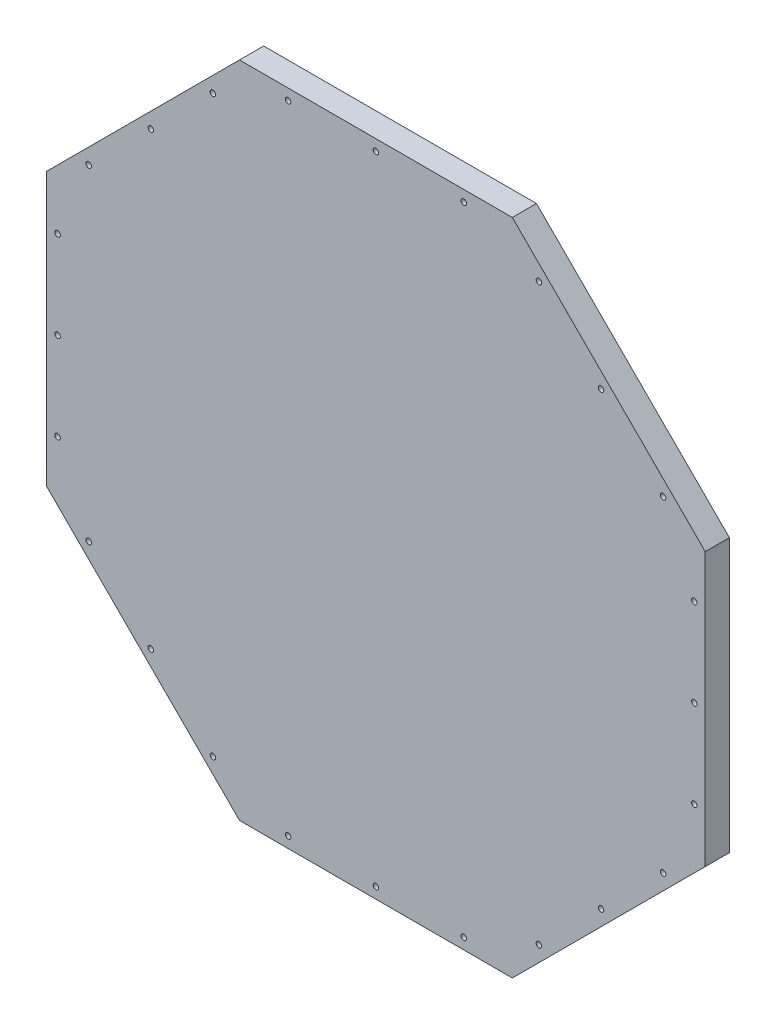
ISO-10303-21;
HEADER;
FILE_DESCRIPTION(('STEP AP214'),'2;1');
FILE_NAME('part.step','',(''),(''),'','','');
FILE_SCHEMA(('AUTOMOTIVE_DESIGN { 1 0 10303 214 1 1 1 1 }'));
ENDSEC;
DATA;
#1=APPLICATION_CONTEXT('core data for automotive mechanical design processes');
#2=APPLICATION_PROTOCOL_DEFINITION('international standard','automotive_design',2000,#1);
#3=PRODUCT_CONTEXT('',#1,'mechanical');
#4=PRODUCT('Part','Part','',(#3));
#5=PRODUCT_RELATED_PRODUCT_CATEGORY('part','',(#4));
#6=PRODUCT_DEFINITION_FORMATION('','',#4);
#7=PRODUCT_DEFINITION_CONTEXT('part definition',#1,'design');
#8=PRODUCT_DEFINITION('design','',#6,#7);
#9=PRODUCT_DEFINITION_SHAPE('','',#8);
#10=(LENGTH_UNIT() NAMED_UNIT(*) SI_UNIT(.MILLI.,.METRE.));
#11=(NAMED_UNIT(*) PLANE_ANGLE_UNIT() SI_UNIT($,.RADIAN.));
#12=(NAMED_UNIT(*) SI_UNIT($,.STERADIAN.) SOLID_ANGLE_UNIT());
#13=UNCERTAINTY_MEASURE_WITH_UNIT(LENGTH_MEASURE(1.E-05),#10,'distance_accuracy_value','');
#14=(GEOMETRIC_REPRESENTATION_CONTEXT(3) GLOBAL_UNCERTAINTY_ASSIGNED_CONTEXT((#13)) GLOBAL_UNIT_ASSIGNED_CONTEXT((#10,
#11,#12)) REPRESENTATION_CONTEXT('',''));
#15=CARTESIAN_POINT('',(0.,0.,0.));
#16=DIRECTION('',(0.,0.,1.));
#17=DIRECTION('',(1.,0.,0.));
#18=AXIS2_PLACEMENT_3D('',#15,#16,#17);
#19=CARTESIAN_POINT('',(0.,0.,22.));
#20=DIRECTION('',(0.,0.,1.));
#21=DIRECTION('',(1.,0.,0.));
#22=AXIS2_PLACEMENT_3D('',#19,#20,#21);
#23=PLANE('',#22);
#24=CARTESIAN_POINT('',(-148.492424049175,261.629509039022,22.));
#25=DIRECTION('',(0.,0.,1.));
#26=DIRECTION('',(1.,0.,0.));
#27=AXIS2_PLACEMENT_3D('',#24,#25,#26);
#28=CIRCLE('',#27,2.50000000000389);
#29=CARTESIAN_POINT('',(-145.992424049171,261.629509039022,22.));
#30=VERTEX_POINT('',#29);
#31=EDGE_CURVE('E308',#30,#30,#28,.T.);
#32=ORIENTED_EDGE('',*,*,#31,.F.);
#33=EDGE_LOOP('',(#32));
#34=FACE_BOUND('',#33,.T.);
#35=CARTESIAN_POINT('',(-289.999999999999,-80.0000000000015,22.));
#36=DIRECTION('',(0.,0.,1.));
#37=DIRECTION('',(1.,0.,0.));
#38=AXIS2_PLACEMENT_3D('',#35,#36,#37);
#39=CIRCLE('',#38,2.50000000000505);
#40=CARTESIAN_POINT('',(-287.499999999993,-80.0000000000015,22.));
#41=VERTEX_POINT('',#40);
#42=EDGE_CURVE('E296',#41,#41,#39,.T.);
#43=ORIENTED_EDGE('',*,*,#42,.F.);
#44=EDGE_LOOP('',(#43));
#45=FACE_BOUND('',#44,.T.);
#46=CARTESIAN_POINT('',(-289.999999999998,-1.49135667060718E-12,22.));
#47=DIRECTION('',(0.,0.,1.));
#48=DIRECTION('',(1.,0.,0.));
#49=AXIS2_PLACEMENT_3D('',#46,#47,#48);
#50=CIRCLE('',#49,2.50000000000482);
#51=CARTESIAN_POINT('',(-287.499999999994,-1.49135667060718E-12,22.));
#52=VERTEX_POINT('',#51);
#53=EDGE_CURVE('E284',#52,#52,#50,.T.);
#54=ORIENTED_EDGE('',*,*,#53,.F.);
#55=EDGE_LOOP('',(#54));
#56=FACE_BOUND('',#55,.T.);
#57=CARTESIAN_POINT('',(-261.62950903902,-148.492424049176,22.));
#58=DIRECTION('',(0.,0.,1.));
#59=DIRECTION('',(1.,0.,0.));
#60=AXIS2_PLACEMENT_3D('',#57,#58,#59);
#61=CIRCLE('',#60,2.500000000005);
#62=CARTESIAN_POINT('',(-259.129509039015,-148.492424049176,22.));
#63=VERTEX_POINT('',#62);
#64=EDGE_CURVE('E272',#63,#63,#61,.T.);
#65=ORIENTED_EDGE('',*,*,#64,.F.);
#66=EDGE_LOOP('',(#65));
#67=FACE_BOUND('',#66,.T.);
#68=CARTESIAN_POINT('',(80.000000000003,-290.,22.));
#69=DIRECTION('',(0.,0.,1.));
#70=DIRECTION('',(1.,0.,0.));
#71=AXIS2_PLACEMENT_3D('',#68,#69,#70);
#72=CIRCLE('',#71,2.50000000000505);
#73=CARTESIAN_POINT('',(82.5000000000081,-290.,22.));
#74=VERTEX_POINT('',#73);
#75=EDGE_CURVE('E260',#74,#74,#72,.T.);
#76=ORIENTED_EDGE('',*,*,#75,.F.);
#77=EDGE_LOOP('',(#76));
#78=FACE_BOUND('',#77,.T.);
#79=CARTESIAN_POINT('',(3.03658391713144E-12,-290.,22.));
#80=DIRECTION('',(0.,0.,1.));
#81=DIRECTION('',(1.,0.,0.));
#82=AXIS2_PLACEMENT_3D('',#79,#80,#81);
#83=CIRCLE('',#82,2.50000000000489);
#84=CARTESIAN_POINT('',(2.50000000000793,-290.,22.));
#85=VERTEX_POINT('',#84);
#86=EDGE_CURVE('E248',#85,#85,#83,.T.);
#87=ORIENTED_EDGE('',*,*,#86,.F.);
#88=EDGE_LOOP('',(#87));
#89=FACE_BOUND('',#88,.T.);
#90=CARTESIAN_POINT('',(148.492424049178,-261.629509039022,22.));
#91=DIRECTION('',(0.,0.,1.));
#92=DIRECTION('',(1.,0.,0.));
#93=AXIS2_PLACEMENT_3D('',#90,#91,#92);
#94=CIRCLE('',#93,2.50000000000353);
#95=CARTESIAN_POINT('',(150.992424049181,-261.629509039022,22.));
#96=VERTEX_POINT('',#95);
#97=EDGE_CURVE('E236',#96,#96,#94,.T.);
#98=ORIENTED_EDGE('',*,*,#97,.F.);
#99=EDGE_LOOP('',(#98));
#100=FACE_BOUND('',#99,.T.);
#101=CARTESIAN_POINT('',(290.000000000002,80.0000000000016,22.));
#102=DIRECTION('',(0.,0.,1.));
#103=DIRECTION('',(1.,0.,0.));
#104=AXIS2_PLACEMENT_3D('',#101,#102,#103);
#105=CIRCLE('',#104,2.50000000000215);
#106=CARTESIAN_POINT('',(292.500000000004,80.0000000000016,22.));
#107=VERTEX_POINT('',#106);
#108=EDGE_CURVE('E224',#107,#107,#105,.T.);
#109=ORIENTED_EDGE('',*,*,#108,.F.);
#110=EDGE_LOOP('',(#109));
#111=FACE_BOUND('',#110,.T.);
#112=CARTESIAN_POINT('',(290.000000000002,1.56686421589173E-12,22.));
#113=DIRECTION('',(0.,0.,1.));
#114=DIRECTION('',(1.,0.,0.));
#115=AXIS2_PLACEMENT_3D('',#112,#113,#114);
#116=CIRCLE('',#115,2.50000000000208);
#117=CARTESIAN_POINT('',(292.500000000004,1.56686421589173E-12,22.));
#118=VERTEX_POINT('',#117);
#119=EDGE_CURVE('E212',#118,#118,#116,.T.);
#120=ORIENTED_EDGE('',*,*,#119,.F.);
#121=EDGE_LOOP('',(#120));
#122=FACE_BOUND('',#121,.T.);
#123=CARTESIAN_POINT('',(261.629509039023,148.492424049176,22.));
#124=DIRECTION('',(0.,0.,1.));
#125=DIRECTION('',(1.,0.,0.));
#126=AXIS2_PLACEMENT_3D('',#123,#124,#125);
#127=CIRCLE('',#126,2.50000000000064);
#128=CARTESIAN_POINT('',(264.129509039024,148.492424049176,22.));
#129=VERTEX_POINT('',#128);
#130=EDGE_CURVE('E200',#129,#129,#127,.T.);
#131=ORIENTED_EDGE('',*,*,#130,.F.);
#132=EDGE_LOOP('',(#131));
#133=FACE_BOUND('',#132,.T.);
#134=CARTESIAN_POINT('',(-80.,290.,22.));
#135=DIRECTION('',(0.,0.,1.));
#136=DIRECTION('',(1.,0.,0.));
#137=AXIS2_PLACEMENT_3D('',#134,#135,#136);
#138=CIRCLE('',#137,2.5);
#139=CARTESIAN_POINT('',(-77.5,290.,22.));
#140=VERTEX_POINT('',#139);
#141=EDGE_CURVE('E188',#140,#140,#138,.T.);
#142=ORIENTED_EDGE('',*,*,#141,.F.);
#143=EDGE_LOOP('',(#142));
#144=FACE_BOUND('',#143,.T.);
#145=CARTESIAN_POINT('',(0.,290.,22.));
#146=DIRECTION('',(0.,0.,1.));
#147=DIRECTION('',(1.,0.,0.));
#148=AXIS2_PLACEMENT_3D('',#145,#146,#147);
#149=CIRCLE('',#148,2.5);
#150=CARTESIAN_POINT('',(2.50000000000002,290.,22.));
#151=VERTEX_POINT('',#150);
#152=EDGE_CURVE('E134',#151,#151,#149,.T.);
#153=ORIENTED_EDGE('',*,*,#152,.F.);
#154=EDGE_LOOP('',(#153));
#155=FACE_BOUND('',#154,.T.);
#156=DIRECTION('',(-0.707106781186547,0.707106781186547,0.));
#157=VECTOR('',#156,1.);
#158=CARTESIAN_POINT('',(300.,124.264068711929,22.));
#159=LINE('',#158,#157);
#160=CARTESIAN_POINT('',(300.,124.264068711929,22.));
#161=VERTEX_POINT('',#160);
#162=CARTESIAN_POINT('',(124.264068711929,300.,22.));
#163=VERTEX_POINT('',#162);
#164=EDGE_CURVE('E145',#161,#163,#159,.T.);
#165=ORIENTED_EDGE('',*,*,#164,.T.);
#166=DIRECTION('',(-1.,0.,0.));
#167=VECTOR('',#166,1.);
#168=CARTESIAN_POINT('',(124.264068711929,300.,22.));
#169=LINE('',#168,#167);
#170=CARTESIAN_POINT('',(-124.264068711929,300.,22.));
#171=VERTEX_POINT('',#170);
#172=EDGE_CURVE('E93',#163,#171,#169,.T.);
#173=ORIENTED_EDGE('',*,*,#172,.T.);
#174=DIRECTION('',(-0.707106781186547,-0.707106781186547,0.));
#175=VECTOR('',#174,1.);
#176=CARTESIAN_POINT('',(-124.264068711929,300.,22.));
#177=LINE('',#176,#175);
#178=CARTESIAN_POINT('',(-300.,124.264068711929,22.));
#179=VERTEX_POINT('',#178);
#180=EDGE_CURVE('E160',#171,#179,#177,.T.);
#181=ORIENTED_EDGE('',*,*,#180,.T.);
#182=DIRECTION('',(0.,-1.,0.));
#183=VECTOR('',#182,1.);
#184=CARTESIAN_POINT('',(-300.,124.264068711929,22.));
#185=LINE('',#184,#183);
#186=CARTESIAN_POINT('',(-300.,-124.264068711929,22.));
#187=VERTEX_POINT('',#186);
#188=EDGE_CURVE('E173',#179,#187,#185,.T.);
#189=ORIENTED_EDGE('',*,*,#188,.T.);
#190=DIRECTION('',(0.707106781186547,-0.707106781186547,0.));
#191=VECTOR('',#190,1.);
#192=CARTESIAN_POINT('',(-300.,-124.264068711929,22.));
#193=LINE('',#192,#191);
#194=CARTESIAN_POINT('',(-124.264068711929,-300.,22.));
#195=VERTEX_POINT('',#194);
#196=EDGE_CURVE('E112',#187,#195,#193,.T.);
#197=ORIENTED_EDGE('',*,*,#196,.T.);
#198=DIRECTION('',(1.,0.,0.));
#199=VECTOR('',#198,1.);
#200=CARTESIAN_POINT('',(-124.264068711929,-300.,22.));
#201=LINE('',#200,#199);
#202=CARTESIAN_POINT('',(124.264068711929,-300.,22.));
#203=VERTEX_POINT('',#202);
#204=EDGE_CURVE('E106',#195,#203,#201,.T.);
#205=ORIENTED_EDGE('',*,*,#204,.T.);
#206=DIRECTION('',(0.707106781186547,0.707106781186548,0.));
#207=VECTOR('',#206,1.);
#208=CARTESIAN_POINT('',(124.264068711929,-300.,22.));
#209=LINE('',#208,#207);
#210=CARTESIAN_POINT('',(300.,-124.264068711929,22.));
#211=VERTEX_POINT('',#210);
#212=EDGE_CURVE('E110',#203,#211,#209,.T.);
#213=ORIENTED_EDGE('',*,*,#212,.T.);
#214=DIRECTION('',(0.,1.,0.));
#215=VECTOR('',#214,1.);
#216=CARTESIAN_POINT('',(300.,-124.264068711929,22.));
#217=LINE('',#216,#215);
#218=EDGE_CURVE('E50',#211,#161,#217,.T.);
#219=ORIENTED_EDGE('',*,*,#218,.T.);
#220=EDGE_LOOP('',(#165,#173,#181,#189,#197,#205,#213,#219));
#221=FACE_BOUND('',#220,.T.);
#222=CARTESIAN_POINT('',(80.,290.,22.));
#223=DIRECTION('',(0.,0.,1.));
#224=DIRECTION('',(1.,0.,0.));
#225=AXIS2_PLACEMENT_3D('',#222,#223,#224);
#226=CIRCLE('',#225,2.5);
#227=CARTESIAN_POINT('',(82.5,290.,22.));
#228=VERTEX_POINT('',#227);
#229=EDGE_CURVE('E182',#228,#228,#226,.T.);
#230=ORIENTED_EDGE('',*,*,#229,.F.);
#231=EDGE_LOOP('',(#230));
#232=FACE_BOUND('',#231,.T.);
#233=CARTESIAN_POINT('',(205.060966544099,205.0609665441,22.));
#234=DIRECTION('',(0.,0.,1.));
#235=DIRECTION('',(1.,0.,0.));
#236=AXIS2_PLACEMENT_3D('',#233,#234,#235);
#237=CIRCLE('',#236,2.50000000000065);
#238=CARTESIAN_POINT('',(207.5609665441,205.0609665441,22.));
#239=VERTEX_POINT('',#238);
#240=EDGE_CURVE('E194',#239,#239,#237,.T.);
#241=ORIENTED_EDGE('',*,*,#240,.F.);
#242=EDGE_LOOP('',(#241));
#243=FACE_BOUND('',#242,.T.);
#244=CARTESIAN_POINT('',(148.492424049175,261.629509039024,22.));
#245=DIRECTION('',(0.,0.,1.));
#246=DIRECTION('',(1.,0.,0.));
#247=AXIS2_PLACEMENT_3D('',#244,#245,#246);
#248=CIRCLE('',#247,2.50000000000063);
#249=CARTESIAN_POINT('',(150.992424049176,261.629509039024,22.));
#250=VERTEX_POINT('',#249);
#251=EDGE_CURVE('E206',#250,#250,#248,.T.);
#252=ORIENTED_EDGE('',*,*,#251,.F.);
#253=EDGE_LOOP('',(#252));
#254=FACE_BOUND('',#253,.T.);
#255=CARTESIAN_POINT('',(290.000000000002,-79.9999999999984,22.));
#256=DIRECTION('',(0.,0.,1.));
#257=DIRECTION('',(1.,0.,0.));
#258=AXIS2_PLACEMENT_3D('',#255,#256,#257);
#259=CIRCLE('',#258,2.50000000000199);
#260=CARTESIAN_POINT('',(292.500000000004,-79.9999999999984,22.));
#261=VERTEX_POINT('',#260);
#262=EDGE_CURVE('E218',#261,#261,#259,.T.);
#263=ORIENTED_EDGE('',*,*,#262,.F.);
#264=EDGE_LOOP('',(#263));
#265=FACE_BOUND('',#264,.T.);
#266=CARTESIAN_POINT('',(205.060966544101,-205.060966544098,22.));
#267=DIRECTION('',(0.,0.,1.));
#268=DIRECTION('',(1.,0.,0.));
#269=AXIS2_PLACEMENT_3D('',#266,#267,#268);
#270=CIRCLE('',#269,2.50000000000364);
#271=CARTESIAN_POINT('',(207.560966544105,-205.060966544098,22.));
#272=VERTEX_POINT('',#271);
#273=EDGE_CURVE('E230',#272,#272,#270,.T.);
#274=ORIENTED_EDGE('',*,*,#273,.F.);
#275=EDGE_LOOP('',(#274));
#276=FACE_BOUND('',#275,.T.);
#277=CARTESIAN_POINT('',(261.629509039025,-148.492424049174,22.));
#278=DIRECTION('',(0.,0.,1.));
#279=DIRECTION('',(1.,0.,0.));
#280=AXIS2_PLACEMENT_3D('',#277,#278,#279);
#281=CIRCLE('',#280,2.50000000000378);
#282=CARTESIAN_POINT('',(264.129509039029,-148.492424049174,22.));
#283=VERTEX_POINT('',#282);
#284=EDGE_CURVE('E242',#283,#283,#281,.T.);
#285=ORIENTED_EDGE('',*,*,#284,.F.);
#286=EDGE_LOOP('',(#285));
#287=FACE_BOUND('',#286,.T.);
#288=CARTESIAN_POINT('',(-79.999999999997,-290.,22.));
#289=DIRECTION('',(0.,0.,1.));
#290=DIRECTION('',(1.,0.,0.));
#291=AXIS2_PLACEMENT_3D('',#288,#289,#290);
#292=CIRCLE('',#291,2.50000000000472);
#293=CARTESIAN_POINT('',(-77.4999999999922,-290.,22.));
#294=VERTEX_POINT('',#293);
#295=EDGE_CURVE('E254',#294,#294,#292,.T.);
#296=ORIENTED_EDGE('',*,*,#295,.F.);
#297=EDGE_LOOP('',(#296));
#298=FACE_BOUND('',#297,.T.);
#299=CARTESIAN_POINT('',(-205.060966544096,-205.0609665441,22.));
#300=DIRECTION('',(0.,0.,1.));
#301=DIRECTION('',(1.,0.,0.));
#302=AXIS2_PLACEMENT_3D('',#299,#300,#301);
#303=CIRCLE('',#302,2.50000000000521);
#304=CARTESIAN_POINT('',(-202.560966544091,-205.0609665441,22.));
#305=VERTEX_POINT('',#304);
#306=EDGE_CURVE('E266',#305,#305,#303,.T.);
#307=ORIENTED_EDGE('',*,*,#306,.F.);
#308=EDGE_LOOP('',(#307));
#309=FACE_BOUND('',#308,.T.);
#310=CARTESIAN_POINT('',(-148.492424049172,-261.629509039024,22.));
#311=DIRECTION('',(0.,0.,1.));
#312=DIRECTION('',(1.,0.,0.));
#313=AXIS2_PLACEMENT_3D('',#310,#311,#312);
#314=CIRCLE('',#313,2.50000000000537);
#315=CARTESIAN_POINT('',(-145.992424049167,-261.629509039024,22.));
#316=VERTEX_POINT('',#315);
#317=EDGE_CURVE('E278',#316,#316,#314,.T.);
#318=ORIENTED_EDGE('',*,*,#317,.F.);
#319=EDGE_LOOP('',(#318));
#320=FACE_BOUND('',#319,.T.);
#321=CARTESIAN_POINT('',(-289.999999999999,79.9999999999985,22.));
#322=DIRECTION('',(0.,0.,1.));
#323=DIRECTION('',(1.,0.,0.));
#324=AXIS2_PLACEMENT_3D('',#321,#322,#323);
#325=CIRCLE('',#324,2.50000000000454);
#326=CARTESIAN_POINT('',(-287.499999999994,79.9999999999985,22.));
#327=VERTEX_POINT('',#326);
#328=EDGE_CURVE('E290',#327,#327,#325,.T.);
#329=ORIENTED_EDGE('',*,*,#328,.F.);
#330=EDGE_LOOP('',(#329));
#331=FACE_BOUND('',#330,.T.);
#332=CARTESIAN_POINT('',(-205.060966544098,205.060966544098,22.));
#333=DIRECTION('',(0.,0.,1.));
#334=DIRECTION('',(1.,0.,0.));
#335=AXIS2_PLACEMENT_3D('',#332,#333,#334);
#336=CIRCLE('',#335,2.50000000000414);
#337=CARTESIAN_POINT('',(-202.560966544094,205.060966544098,22.));
#338=VERTEX_POINT('',#337);
#339=EDGE_CURVE('E302',#338,#338,#336,.T.);
#340=ORIENTED_EDGE('',*,*,#339,.F.);
#341=EDGE_LOOP('',(#340));
#342=FACE_BOUND('',#341,.T.);
#343=CARTESIAN_POINT('',(-261.629509039022,148.492424049174,22.));
#344=DIRECTION('',(0.,0.,1.));
#345=DIRECTION('',(1.,0.,0.));
#346=AXIS2_PLACEMENT_3D('',#343,#344,#345);
#347=CIRCLE('',#346,2.50000000000438);
#348=CARTESIAN_POINT('',(-259.129509039018,148.492424049174,22.));
#349=VERTEX_POINT('',#348);
#350=EDGE_CURVE('E314',#349,#349,#347,.T.);
#351=ORIENTED_EDGE('',*,*,#350,.F.);
#352=EDGE_LOOP('',(#351));
#353=FACE_BOUND('',#352,.T.);
#354=ADVANCED_FACE('F33',(#34,#45,#56,#67,#78,#89,#100,#111,#122,#133,#144,#155,#221,#232,#243,
#254,#265,#276,#287,#298,#309,#320,#331,#342,#353),#23,.T.);
#355=CARTESIAN_POINT('',(0.,0.,0.));
#356=DIRECTION('',(0.,0.,1.));
#357=DIRECTION('',(1.,0.,0.));
#358=AXIS2_PLACEMENT_3D('',#355,#356,#357);
#359=PLANE('',#358);
#360=DIRECTION('',(-0.707106781186547,0.707106781186547,0.));
#361=VECTOR('',#360,1.);
#362=CARTESIAN_POINT('',(300.,124.264068711929,0.));
#363=LINE('',#362,#361);
#364=CARTESIAN_POINT('',(300.,124.264068711929,0.));
#365=VERTEX_POINT('',#364);
#366=CARTESIAN_POINT('',(124.264068711929,300.,0.));
#367=VERTEX_POINT('',#366);
#368=EDGE_CURVE('E130',#365,#367,#363,.T.);
#369=ORIENTED_EDGE('',*,*,#368,.F.);
#370=DIRECTION('',(0.,1.,0.));
#371=VECTOR('',#370,1.);
#372=CARTESIAN_POINT('',(300.,-124.264068711929,0.));
#373=LINE('',#372,#371);
#374=CARTESIAN_POINT('',(300.,-124.264068711929,0.));
#375=VERTEX_POINT('',#374);
#376=EDGE_CURVE('E85',#375,#365,#373,.T.);
#377=ORIENTED_EDGE('',*,*,#376,.F.);
#378=DIRECTION('',(0.707106781186547,0.707106781186548,0.));
#379=VECTOR('',#378,1.);
#380=CARTESIAN_POINT('',(124.264068711929,-300.,0.));
#381=LINE('',#380,#379);
#382=CARTESIAN_POINT('',(124.264068711929,-300.,0.));
#383=VERTEX_POINT('',#382);
#384=EDGE_CURVE('E79',#383,#375,#381,.T.);
#385=ORIENTED_EDGE('',*,*,#384,.F.);
#386=DIRECTION('',(1.,0.,0.));
#387=VECTOR('',#386,1.);
#388=CARTESIAN_POINT('',(-124.264068711929,-300.,0.));
#389=LINE('',#388,#387);
#390=CARTESIAN_POINT('',(-124.264068711929,-300.,0.));
#391=VERTEX_POINT('',#390);
#392=EDGE_CURVE('E120',#391,#383,#389,.T.);
#393=ORIENTED_EDGE('',*,*,#392,.F.);
#394=DIRECTION('',(0.707106781186547,-0.707106781186547,0.));
#395=VECTOR('',#394,1.);
#396=CARTESIAN_POINT('',(-300.,-124.264068711929,0.));
#397=LINE('',#396,#395);
#398=CARTESIAN_POINT('',(-300.,-124.264068711929,0.));
#399=VERTEX_POINT('',#398);
#400=EDGE_CURVE('E140',#399,#391,#397,.T.);
#401=ORIENTED_EDGE('',*,*,#400,.F.);
#402=DIRECTION('',(0.,-1.,0.));
#403=VECTOR('',#402,1.);
#404=CARTESIAN_POINT('',(-300.,124.264068711929,0.));
#405=LINE('',#404,#403);
#406=CARTESIAN_POINT('',(-300.,124.264068711929,0.));
#407=VERTEX_POINT('',#406);
#408=EDGE_CURVE('E138',#407,#399,#405,.T.);
#409=ORIENTED_EDGE('',*,*,#408,.F.);
#410=DIRECTION('',(-0.707106781186547,-0.707106781186547,0.));
#411=VECTOR('',#410,1.);
#412=CARTESIAN_POINT('',(-124.264068711929,300.,0.));
#413=LINE('',#412,#411);
#414=CARTESIAN_POINT('',(-124.264068711929,300.,0.));
#415=VERTEX_POINT('',#414);
#416=EDGE_CURVE('E136',#415,#407,#413,.T.);
#417=ORIENTED_EDGE('',*,*,#416,.F.);
#418=DIRECTION('',(-1.,0.,0.));
#419=VECTOR('',#418,1.);
#420=CARTESIAN_POINT('',(124.264068711929,300.,0.));
#421=LINE('',#420,#419);
#422=EDGE_CURVE('E133',#367,#415,#421,.T.);
#423=ORIENTED_EDGE('',*,*,#422,.F.);
#424=EDGE_LOOP('',(#369,#377,#385,#393,#401,#409,#417,#423));
#425=FACE_BOUND('',#424,.T.);
#426=CARTESIAN_POINT('',(0.,290.,0.));
#427=DIRECTION('',(0.,0.,1.));
#428=DIRECTION('',(1.,0.,0.));
#429=AXIS2_PLACEMENT_3D('',#426,#427,#428);
#430=CIRCLE('',#429,2.5);
#431=CARTESIAN_POINT('',(2.50000000000002,290.,0.));
#432=VERTEX_POINT('',#431);
#433=EDGE_CURVE('E179',#432,#432,#430,.T.);
#434=ORIENTED_EDGE('',*,*,#433,.T.);
#435=EDGE_LOOP('',(#434));
#436=FACE_BOUND('',#435,.T.);
#437=CARTESIAN_POINT('',(80.,290.,0.));
#438=DIRECTION('',(0.,0.,1.));
#439=DIRECTION('',(1.,0.,0.));
#440=AXIS2_PLACEMENT_3D('',#437,#438,#439);
#441=CIRCLE('',#440,2.5);
#442=CARTESIAN_POINT('',(82.5,290.,0.));
#443=VERTEX_POINT('',#442);
#444=EDGE_CURVE('E185',#443,#443,#441,.T.);
#445=ORIENTED_EDGE('',*,*,#444,.T.);
#446=EDGE_LOOP('',(#445));
#447=FACE_BOUND('',#446,.T.);
#448=CARTESIAN_POINT('',(-80.,290.,0.));
#449=DIRECTION('',(0.,0.,1.));
#450=DIRECTION('',(1.,0.,0.));
#451=AXIS2_PLACEMENT_3D('',#448,#449,#450);
#452=CIRCLE('',#451,2.5);
#453=CARTESIAN_POINT('',(-77.5,290.,0.));
#454=VERTEX_POINT('',#453);
#455=EDGE_CURVE('E191',#454,#454,#452,.T.);
#456=ORIENTED_EDGE('',*,*,#455,.T.);
#457=EDGE_LOOP('',(#456));
#458=FACE_BOUND('',#457,.T.);
#459=CARTESIAN_POINT('',(205.060966544099,205.0609665441,0.));
#460=DIRECTION('',(0.,0.,1.));
#461=DIRECTION('',(1.,0.,0.));
#462=AXIS2_PLACEMENT_3D('',#459,#460,#461);
#463=CIRCLE('',#462,2.50000000000065);
#464=CARTESIAN_POINT('',(207.5609665441,205.0609665441,0.));
#465=VERTEX_POINT('',#464);
#466=EDGE_CURVE('E197',#465,#465,#463,.T.);
#467=ORIENTED_EDGE('',*,*,#466,.T.);
#468=EDGE_LOOP('',(#467));
#469=FACE_BOUND('',#468,.T.);
#470=CARTESIAN_POINT('',(261.629509039023,148.492424049176,0.));
#471=DIRECTION('',(0.,0.,1.));
#472=DIRECTION('',(1.,0.,0.));
#473=AXIS2_PLACEMENT_3D('',#470,#471,#472);
#474=CIRCLE('',#473,2.50000000000064);
#475=CARTESIAN_POINT('',(264.129509039024,148.492424049176,0.));
#476=VERTEX_POINT('',#475);
#477=EDGE_CURVE('E203',#476,#476,#474,.T.);
#478=ORIENTED_EDGE('',*,*,#477,.T.);
#479=EDGE_LOOP('',(#478));
#480=FACE_BOUND('',#479,.T.);
#481=CARTESIAN_POINT('',(148.492424049175,261.629509039024,0.));
#482=DIRECTION('',(0.,0.,1.));
#483=DIRECTION('',(1.,0.,0.));
#484=AXIS2_PLACEMENT_3D('',#481,#482,#483);
#485=CIRCLE('',#484,2.50000000000063);
#486=CARTESIAN_POINT('',(150.992424049176,261.629509039024,0.));
#487=VERTEX_POINT('',#486);
#488=EDGE_CURVE('E209',#487,#487,#485,.T.);
#489=ORIENTED_EDGE('',*,*,#488,.T.);
#490=EDGE_LOOP('',(#489));
#491=FACE_BOUND('',#490,.T.);
#492=CARTESIAN_POINT('',(290.000000000002,1.56686421589173E-12,0.));
#493=DIRECTION('',(0.,0.,1.));
#494=DIRECTION('',(1.,0.,0.));
#495=AXIS2_PLACEMENT_3D('',#492,#493,#494);
#496=CIRCLE('',#495,2.50000000000208);
#497=CARTESIAN_POINT('',(292.500000000004,1.56686421589173E-12,0.));
#498=VERTEX_POINT('',#497);
#499=EDGE_CURVE('E215',#498,#498,#496,.T.);
#500=ORIENTED_EDGE('',*,*,#499,.T.);
#501=EDGE_LOOP('',(#500));
#502=FACE_BOUND('',#501,.T.);
#503=CARTESIAN_POINT('',(290.000000000002,-79.9999999999984,0.));
#504=DIRECTION('',(0.,0.,1.));
#505=DIRECTION('',(1.,0.,0.));
#506=AXIS2_PLACEMENT_3D('',#503,#504,#505);
#507=CIRCLE('',#506,2.50000000000199);
#508=CARTESIAN_POINT('',(292.500000000004,-79.9999999999984,0.));
#509=VERTEX_POINT('',#508);
#510=EDGE_CURVE('E221',#509,#509,#507,.T.);
#511=ORIENTED_EDGE('',*,*,#510,.T.);
#512=EDGE_LOOP('',(#511));
#513=FACE_BOUND('',#512,.T.);
#514=CARTESIAN_POINT('',(290.000000000002,80.0000000000016,0.));
#515=DIRECTION('',(0.,0.,1.));
#516=DIRECTION('',(1.,0.,0.));
#517=AXIS2_PLACEMENT_3D('',#514,#515,#516);
#518=CIRCLE('',#517,2.50000000000215);
#519=CARTESIAN_POINT('',(292.500000000004,80.0000000000016,0.));
#520=VERTEX_POINT('',#519);
#521=EDGE_CURVE('E227',#520,#520,#518,.T.);
#522=ORIENTED_EDGE('',*,*,#521,.T.);
#523=EDGE_LOOP('',(#522));
#524=FACE_BOUND('',#523,.T.);
#525=CARTESIAN_POINT('',(205.060966544101,-205.060966544098,0.));
#526=DIRECTION('',(0.,0.,1.));
#527=DIRECTION('',(1.,0.,0.));
#528=AXIS2_PLACEMENT_3D('',#525,#526,#527);
#529=CIRCLE('',#528,2.50000000000364);
#530=CARTESIAN_POINT('',(207.560966544105,-205.060966544098,0.));
#531=VERTEX_POINT('',#530);
#532=EDGE_CURVE('E233',#531,#531,#529,.T.);
#533=ORIENTED_EDGE('',*,*,#532,.T.);
#534=EDGE_LOOP('',(#533));
#535=FACE_BOUND('',#534,.T.);
#536=CARTESIAN_POINT('',(148.492424049178,-261.629509039022,0.));
#537=DIRECTION('',(0.,0.,1.));
#538=DIRECTION('',(1.,0.,0.));
#539=AXIS2_PLACEMENT_3D('',#536,#537,#538);
#540=CIRCLE('',#539,2.50000000000353);
#541=CARTESIAN_POINT('',(150.992424049181,-261.629509039022,0.));
#542=VERTEX_POINT('',#541);
#543=EDGE_CURVE('E239',#542,#542,#540,.T.);
#544=ORIENTED_EDGE('',*,*,#543,.T.);
#545=EDGE_LOOP('',(#544));
#546=FACE_BOUND('',#545,.T.);
#547=CARTESIAN_POINT('',(261.629509039025,-148.492424049174,0.));
#548=DIRECTION('',(0.,0.,1.));
#549=DIRECTION('',(1.,0.,0.));
#550=AXIS2_PLACEMENT_3D('',#547,#548,#549);
#551=CIRCLE('',#550,2.50000000000378);
#552=CARTESIAN_POINT('',(264.129509039029,-148.492424049174,0.));
#553=VERTEX_POINT('',#552);
#554=EDGE_CURVE('E245',#553,#553,#551,.T.);
#555=ORIENTED_EDGE('',*,*,#554,.T.);
#556=EDGE_LOOP('',(#555));
#557=FACE_BOUND('',#556,.T.);
#558=CARTESIAN_POINT('',(3.03658391713144E-12,-290.,0.));
#559=DIRECTION('',(0.,0.,1.));
#560=DIRECTION('',(1.,0.,0.));
#561=AXIS2_PLACEMENT_3D('',#558,#559,#560);
#562=CIRCLE('',#561,2.50000000000489);
#563=CARTESIAN_POINT('',(2.50000000000793,-290.,0.));
#564=VERTEX_POINT('',#563);
#565=EDGE_CURVE('E251',#564,#564,#562,.T.);
#566=ORIENTED_EDGE('',*,*,#565,.T.);
#567=EDGE_LOOP('',(#566));
#568=FACE_BOUND('',#567,.T.);
#569=CARTESIAN_POINT('',(-79.999999999997,-290.,0.));
#570=DIRECTION('',(0.,0.,1.));
#571=DIRECTION('',(1.,0.,0.));
#572=AXIS2_PLACEMENT_3D('',#569,#570,#571);
#573=CIRCLE('',#572,2.50000000000472);
#574=CARTESIAN_POINT('',(-77.4999999999922,-290.,0.));
#575=VERTEX_POINT('',#574);
#576=EDGE_CURVE('E257',#575,#575,#573,.T.);
#577=ORIENTED_EDGE('',*,*,#576,.T.);
#578=EDGE_LOOP('',(#577));
#579=FACE_BOUND('',#578,.T.);
#580=CARTESIAN_POINT('',(80.000000000003,-290.,0.));
#581=DIRECTION('',(0.,0.,1.));
#582=DIRECTION('',(1.,0.,0.));
#583=AXIS2_PLACEMENT_3D('',#580,#581,#582);
#584=CIRCLE('',#583,2.50000000000505);
#585=CARTESIAN_POINT('',(82.5000000000081,-290.,0.));
#586=VERTEX_POINT('',#585);
#587=EDGE_CURVE('E263',#586,#586,#584,.T.);
#588=ORIENTED_EDGE('',*,*,#587,.T.);
#589=EDGE_LOOP('',(#588));
#590=FACE_BOUND('',#589,.T.);
#591=CARTESIAN_POINT('',(-205.060966544096,-205.0609665441,0.));
#592=DIRECTION('',(0.,0.,1.));
#593=DIRECTION('',(1.,0.,0.));
#594=AXIS2_PLACEMENT_3D('',#591,#592,#593);
#595=CIRCLE('',#594,2.50000000000521);
#596=CARTESIAN_POINT('',(-202.560966544091,-205.0609665441,0.));
#597=VERTEX_POINT('',#596);
#598=EDGE_CURVE('E269',#597,#597,#595,.T.);
#599=ORIENTED_EDGE('',*,*,#598,.T.);
#600=EDGE_LOOP('',(#599));
#601=FACE_BOUND('',#600,.T.);
#602=CARTESIAN_POINT('',(-261.62950903902,-148.492424049176,0.));
#603=DIRECTION('',(0.,0.,1.));
#604=DIRECTION('',(1.,0.,0.));
#605=AXIS2_PLACEMENT_3D('',#602,#603,#604);
#606=CIRCLE('',#605,2.500000000005);
#607=CARTESIAN_POINT('',(-259.129509039015,-148.492424049176,0.));
#608=VERTEX_POINT('',#607);
#609=EDGE_CURVE('E275',#608,#608,#606,.T.);
#610=ORIENTED_EDGE('',*,*,#609,.T.);
#611=EDGE_LOOP('',(#610));
#612=FACE_BOUND('',#611,.T.);
#613=CARTESIAN_POINT('',(-148.492424049172,-261.629509039024,0.));
#614=DIRECTION('',(0.,0.,1.));
#615=DIRECTION('',(1.,0.,0.));
#616=AXIS2_PLACEMENT_3D('',#613,#614,#615);
#617=CIRCLE('',#616,2.50000000000537);
#618=CARTESIAN_POINT('',(-145.992424049167,-261.629509039024,0.));
#619=VERTEX_POINT('',#618);
#620=EDGE_CURVE('E281',#619,#619,#617,.T.);
#621=ORIENTED_EDGE('',*,*,#620,.T.);
#622=EDGE_LOOP('',(#621));
#623=FACE_BOUND('',#622,.T.);
#624=CARTESIAN_POINT('',(-289.999999999998,-1.49135667060718E-12,0.));
#625=DIRECTION('',(0.,0.,1.));
#626=DIRECTION('',(1.,0.,0.));
#627=AXIS2_PLACEMENT_3D('',#624,#625,#626);
#628=CIRCLE('',#627,2.50000000000482);
#629=CARTESIAN_POINT('',(-287.499999999994,-1.49135667060718E-12,0.));
#630=VERTEX_POINT('',#629);
#631=EDGE_CURVE('E287',#630,#630,#628,.T.);
#632=ORIENTED_EDGE('',*,*,#631,.T.);
#633=EDGE_LOOP('',(#632));
#634=FACE_BOUND('',#633,.T.);
#635=CARTESIAN_POINT('',(-289.999999999999,79.9999999999985,0.));
#636=DIRECTION('',(0.,0.,1.));
#637=DIRECTION('',(1.,0.,0.));
#638=AXIS2_PLACEMENT_3D('',#635,#636,#637);
#639=CIRCLE('',#638,2.50000000000454);
#640=CARTESIAN_POINT('',(-287.499999999994,79.9999999999985,0.));
#641=VERTEX_POINT('',#640);
#642=EDGE_CURVE('E293',#641,#641,#639,.T.);
#643=ORIENTED_EDGE('',*,*,#642,.T.);
#644=EDGE_LOOP('',(#643));
#645=FACE_BOUND('',#644,.T.);
#646=CARTESIAN_POINT('',(-289.999999999999,-80.0000000000015,0.));
#647=DIRECTION('',(0.,0.,1.));
#648=DIRECTION('',(1.,0.,0.));
#649=AXIS2_PLACEMENT_3D('',#646,#647,#648);
#650=CIRCLE('',#649,2.50000000000505);
#651=CARTESIAN_POINT('',(-287.499999999993,-80.0000000000015,0.));
#652=VERTEX_POINT('',#651);
#653=EDGE_CURVE('E299',#652,#652,#650,.T.);
#654=ORIENTED_EDGE('',*,*,#653,.T.);
#655=EDGE_LOOP('',(#654));
#656=FACE_BOUND('',#655,.T.);
#657=CARTESIAN_POINT('',(-205.060966544098,205.060966544098,0.));
#658=DIRECTION('',(0.,0.,1.));
#659=DIRECTION('',(1.,0.,0.));
#660=AXIS2_PLACEMENT_3D('',#657,#658,#659);
#661=CIRCLE('',#660,2.50000000000414);
#662=CARTESIAN_POINT('',(-202.560966544094,205.060966544098,0.));
#663=VERTEX_POINT('',#662);
#664=EDGE_CURVE('E305',#663,#663,#661,.T.);
#665=ORIENTED_EDGE('',*,*,#664,.T.);
#666=EDGE_LOOP('',(#665));
#667=FACE_BOUND('',#666,.T.);
#668=CARTESIAN_POINT('',(-148.492424049175,261.629509039022,0.));
#669=DIRECTION('',(0.,0.,1.));
#670=DIRECTION('',(1.,0.,0.));
#671=AXIS2_PLACEMENT_3D('',#668,#669,#670);
#672=CIRCLE('',#671,2.50000000000389);
#673=CARTESIAN_POINT('',(-145.992424049171,261.629509039022,0.));
#674=VERTEX_POINT('',#673);
#675=EDGE_CURVE('E311',#674,#674,#672,.T.);
#676=ORIENTED_EDGE('',*,*,#675,.T.);
#677=EDGE_LOOP('',(#676));
#678=FACE_BOUND('',#677,.T.);
#679=CARTESIAN_POINT('',(-261.629509039022,148.492424049174,0.));
#680=DIRECTION('',(0.,0.,1.));
#681=DIRECTION('',(1.,0.,0.));
#682=AXIS2_PLACEMENT_3D('',#679,#680,#681);
#683=CIRCLE('',#682,2.50000000000438);
#684=CARTESIAN_POINT('',(-259.129509039018,148.492424049174,0.));
#685=VERTEX_POINT('',#684);
#686=EDGE_CURVE('E317',#685,#685,#683,.T.);
#687=ORIENTED_EDGE('',*,*,#686,.T.);
#688=EDGE_LOOP('',(#687));
#689=FACE_BOUND('',#688,.T.);
#690=ADVANCED_FACE('F164',(#425,#436,#447,#458,#469,#480,#491,#502,#513,#524,#535,#546,#557,
#568,#579,#590,#601,#612,#623,#634,#645,#656,#667,#678,#689),#359,.F.);
#691=CARTESIAN_POINT('',(300.,124.264068711929,22.));
#692=DIRECTION('',(-0.707106781186548,-0.707106781186548,0.));
#693=DIRECTION('',(0.707106781186548,-0.707106781186548,0.));
#694=AXIS2_PLACEMENT_3D('',#691,#692,#693);
#695=PLANE('',#694);
#696=ORIENTED_EDGE('',*,*,#368,.T.);
#697=DIRECTION('',(0.,0.,-1.));
#698=VECTOR('',#697,1.);
#699=CARTESIAN_POINT('',(124.264068711929,300.,22.));
#700=LINE('',#699,#698);
#701=EDGE_CURVE('E11',#163,#367,#700,.T.);
#702=ORIENTED_EDGE('',*,*,#701,.F.);
#703=ORIENTED_EDGE('',*,*,#164,.F.);
#704=DIRECTION('',(0.,0.,-1.));
#705=VECTOR('',#704,1.);
#706=CARTESIAN_POINT('',(300.,124.264068711929,22.));
#707=LINE('',#706,#705);
#708=EDGE_CURVE('E126',#161,#365,#707,.T.);
#709=ORIENTED_EDGE('',*,*,#708,.T.);
#710=EDGE_LOOP('',(#696,#702,#703,#709));
#711=FACE_BOUND('',#710,.T.);
#712=ADVANCED_FACE('F35',(#711),#695,.F.);
#713=CARTESIAN_POINT('',(124.264068711929,300.,22.));
#714=DIRECTION('',(0.,-1.,0.));
#715=DIRECTION('',(1.,0.,0.));
#716=AXIS2_PLACEMENT_3D('',#713,#714,#715);
#717=PLANE('',#716);
#718=ORIENTED_EDGE('',*,*,#422,.T.);
#719=DIRECTION('',(0.,0.,-1.));
#720=VECTOR('',#719,1.);
#721=CARTESIAN_POINT('',(-124.264068711929,300.,22.));
#722=LINE('',#721,#720);
#723=EDGE_CURVE('E42',#171,#415,#722,.T.);
#724=ORIENTED_EDGE('',*,*,#723,.F.);
#725=ORIENTED_EDGE('',*,*,#172,.F.);
#726=ORIENTED_EDGE('',*,*,#701,.T.);
#727=EDGE_LOOP('',(#718,#724,#725,#726));
#728=FACE_BOUND('',#727,.T.);
#729=ADVANCED_FACE('F351',(#728),#717,.F.);
#730=CARTESIAN_POINT('',(-124.264068711929,300.,22.));
#731=DIRECTION('',(0.707106781186548,-0.707106781186547,0.));
#732=DIRECTION('',(0.707106781186547,0.707106781186548,0.));
#733=AXIS2_PLACEMENT_3D('',#730,#731,#732);
#734=PLANE('',#733);
#735=ORIENTED_EDGE('',*,*,#416,.T.);
#736=DIRECTION('',(0.,0.,-1.));
#737=VECTOR('',#736,1.);
#738=CARTESIAN_POINT('',(-300.,124.264068711929,22.));
#739=LINE('',#738,#737);
#740=EDGE_CURVE('E152',#179,#407,#739,.T.);
#741=ORIENTED_EDGE('',*,*,#740,.F.);
#742=ORIENTED_EDGE('',*,*,#180,.F.);
#743=ORIENTED_EDGE('',*,*,#723,.T.);
#744=EDGE_LOOP('',(#735,#741,#742,#743));
#745=FACE_BOUND('',#744,.T.);
#746=ADVANCED_FACE('F158',(#745),#734,.F.);
#747=CARTESIAN_POINT('',(-300.,124.264068711929,22.));
#748=DIRECTION('',(1.,0.,0.));
#749=DIRECTION('',(0.,1.,0.));
#750=AXIS2_PLACEMENT_3D('',#747,#748,#749);
#751=PLANE('',#750);
#752=ORIENTED_EDGE('',*,*,#408,.T.);
#753=DIRECTION('',(0.,0.,-1.));
#754=VECTOR('',#753,1.);
#755=CARTESIAN_POINT('',(-300.,-124.264068711929,22.));
#756=LINE('',#755,#754);
#757=EDGE_CURVE('E149',#187,#399,#756,.T.);
#758=ORIENTED_EDGE('',*,*,#757,.F.);
#759=ORIENTED_EDGE('',*,*,#188,.F.);
#760=ORIENTED_EDGE('',*,*,#740,.T.);
#761=EDGE_LOOP('',(#752,#758,#759,#760));
#762=FACE_BOUND('',#761,.T.);
#763=ADVANCED_FACE('F169',(#762),#751,.F.);
#764=CARTESIAN_POINT('',(-300.,-124.264068711929,22.));
#765=DIRECTION('',(0.707106781186548,0.707106781186548,0.));
#766=DIRECTION('',(-0.707106781186548,0.707106781186548,0.));
#767=AXIS2_PLACEMENT_3D('',#764,#765,#766);
#768=PLANE('',#767);
#769=ORIENTED_EDGE('',*,*,#400,.T.);
#770=DIRECTION('',(0.,0.,-1.));
#771=VECTOR('',#770,1.);
#772=CARTESIAN_POINT('',(-124.264068711929,-300.,22.));
#773=LINE('',#772,#771);
#774=EDGE_CURVE('E121',#195,#391,#773,.T.);
#775=ORIENTED_EDGE('',*,*,#774,.F.);
#776=ORIENTED_EDGE('',*,*,#196,.F.);
#777=ORIENTED_EDGE('',*,*,#757,.T.);
#778=EDGE_LOOP('',(#769,#775,#776,#777));
#779=FACE_BOUND('',#778,.T.);
#780=ADVANCED_FACE('F172',(#779),#768,.F.);
#781=CARTESIAN_POINT('',(-124.264068711929,-300.,22.));
#782=DIRECTION('',(0.,1.,0.));
#783=DIRECTION('',(-1.,0.,0.));
#784=AXIS2_PLACEMENT_3D('',#781,#782,#783);
#785=PLANE('',#784);
#786=ORIENTED_EDGE('',*,*,#392,.T.);
#787=DIRECTION('',(0.,0.,-1.));
#788=VECTOR('',#787,1.);
#789=CARTESIAN_POINT('',(124.264068711929,-300.,22.));
#790=LINE('',#789,#788);
#791=EDGE_CURVE('E117',#203,#383,#790,.T.);
#792=ORIENTED_EDGE('',*,*,#791,.F.);
#793=ORIENTED_EDGE('',*,*,#204,.F.);
#794=ORIENTED_EDGE('',*,*,#774,.T.);
#795=EDGE_LOOP('',(#786,#792,#793,#794));
#796=FACE_BOUND('',#795,.T.);
#797=ADVANCED_FACE('F118',(#796),#785,.F.);
#798=CARTESIAN_POINT('',(124.264068711929,-300.,22.));
#799=DIRECTION('',(-0.707106781186548,0.707106781186547,0.));
#800=DIRECTION('',(-0.707106781186547,-0.707106781186548,0.));
#801=AXIS2_PLACEMENT_3D('',#798,#799,#800);
#802=PLANE('',#801);
#803=ORIENTED_EDGE('',*,*,#384,.T.);
#804=DIRECTION('',(0.,0.,-1.));
#805=VECTOR('',#804,1.);
#806=CARTESIAN_POINT('',(300.,-124.264068711929,22.));
#807=LINE('',#806,#805);
#808=EDGE_CURVE('E122',#211,#375,#807,.T.);
#809=ORIENTED_EDGE('',*,*,#808,.F.);
#810=ORIENTED_EDGE('',*,*,#212,.F.);
#811=ORIENTED_EDGE('',*,*,#791,.T.);
#812=EDGE_LOOP('',(#803,#809,#810,#811));
#813=FACE_BOUND('',#812,.T.);
#814=ADVANCED_FACE('F124',(#813),#802,.F.);
#815=CARTESIAN_POINT('',(300.,-124.264068711929,22.));
#816=DIRECTION('',(-1.,0.,0.));
#817=DIRECTION('',(0.,-1.,0.));
#818=AXIS2_PLACEMENT_3D('',#815,#816,#817);
#819=PLANE('',#818);
#820=ORIENTED_EDGE('',*,*,#376,.T.);
#821=ORIENTED_EDGE('',*,*,#708,.F.);
#822=ORIENTED_EDGE('',*,*,#218,.F.);
#823=ORIENTED_EDGE('',*,*,#808,.T.);
#824=EDGE_LOOP('',(#820,#821,#822,#823));
#825=FACE_BOUND('',#824,.T.);
#826=ADVANCED_FACE('F339',(#825),#819,.F.);
#827=CARTESIAN_POINT('',(0.,290.,22.));
#828=DIRECTION('',(0.,0.,-1.));
#829=DIRECTION('',(-1.,0.,0.));
#830=AXIS2_PLACEMENT_3D('',#827,#828,#829);
#831=CYLINDRICAL_SURFACE('',#830,2.5);
#832=ORIENTED_EDGE('',*,*,#152,.T.);
#833=EDGE_LOOP('',(#832));
#834=FACE_BOUND('',#833,.T.);
#835=ORIENTED_EDGE('',*,*,#433,.F.);
#836=EDGE_LOOP('',(#835));
#837=FACE_BOUND('',#836,.T.);
#838=ADVANCED_FACE('F336',(#834,#837),#831,.F.);
#839=CARTESIAN_POINT('',(80.,290.,22.));
#840=DIRECTION('',(0.,0.,-1.));
#841=DIRECTION('',(-1.,0.,0.));
#842=AXIS2_PLACEMENT_3D('',#839,#840,#841);
#843=CYLINDRICAL_SURFACE('',#842,2.5);
#844=ORIENTED_EDGE('',*,*,#229,.T.);
#845=EDGE_LOOP('',(#844));
#846=FACE_BOUND('',#845,.T.);
#847=ORIENTED_EDGE('',*,*,#444,.F.);
#848=EDGE_LOOP('',(#847));
#849=FACE_BOUND('',#848,.T.);
#850=ADVANCED_FACE('F415',(#846,#849),#843,.F.);
#851=CARTESIAN_POINT('',(-80.,290.,22.));
#852=DIRECTION('',(0.,0.,-1.));
#853=DIRECTION('',(-1.,0.,0.));
#854=AXIS2_PLACEMENT_3D('',#851,#852,#853);
#855=CYLINDRICAL_SURFACE('',#854,2.5);
#856=ORIENTED_EDGE('',*,*,#141,.T.);
#857=EDGE_LOOP('',(#856));
#858=FACE_BOUND('',#857,.T.);
#859=ORIENTED_EDGE('',*,*,#455,.F.);
#860=EDGE_LOOP('',(#859));
#861=FACE_BOUND('',#860,.T.);
#862=ADVANCED_FACE('F423',(#858,#861),#855,.F.);
#863=CARTESIAN_POINT('',(205.060966544099,205.0609665441,22.));
#864=DIRECTION('',(0.,0.,-1.));
#865=DIRECTION('',(-1.,0.,0.));
#866=AXIS2_PLACEMENT_3D('',#863,#864,#865);
#867=CYLINDRICAL_SURFACE('',#866,2.50000000000065);
#868=ORIENTED_EDGE('',*,*,#240,.T.);
#869=EDGE_LOOP('',(#868));
#870=FACE_BOUND('',#869,.T.);
#871=ORIENTED_EDGE('',*,*,#466,.F.);
#872=EDGE_LOOP('',(#871));
#873=FACE_BOUND('',#872,.T.);
#874=ADVANCED_FACE('F431',(#870,#873),#867,.F.);
#875=CARTESIAN_POINT('',(261.629509039023,148.492424049176,22.));
#876=DIRECTION('',(0.,0.,-1.));
#877=DIRECTION('',(-1.,0.,0.));
#878=AXIS2_PLACEMENT_3D('',#875,#876,#877);
#879=CYLINDRICAL_SURFACE('',#878,2.50000000000064);
#880=ORIENTED_EDGE('',*,*,#130,.T.);
#881=EDGE_LOOP('',(#880));
#882=FACE_BOUND('',#881,.T.);
#883=ORIENTED_EDGE('',*,*,#477,.F.);
#884=EDGE_LOOP('',(#883));
#885=FACE_BOUND('',#884,.T.);
#886=ADVANCED_FACE('F440',(#882,#885),#879,.F.);
#887=CARTESIAN_POINT('',(148.492424049175,261.629509039024,22.));
#888=DIRECTION('',(0.,0.,-1.));
#889=DIRECTION('',(-1.,0.,0.));
#890=AXIS2_PLACEMENT_3D('',#887,#888,#889);
#891=CYLINDRICAL_SURFACE('',#890,2.50000000000063);
#892=ORIENTED_EDGE('',*,*,#251,.T.);
#893=EDGE_LOOP('',(#892));
#894=FACE_BOUND('',#893,.T.);
#895=ORIENTED_EDGE('',*,*,#488,.F.);
#896=EDGE_LOOP('',(#895));
#897=FACE_BOUND('',#896,.T.);
#898=ADVANCED_FACE('F449',(#894,#897),#891,.F.);
#899=CARTESIAN_POINT('',(290.000000000002,1.56686421589173E-12,22.));
#900=DIRECTION('',(0.,0.,-1.));
#901=DIRECTION('',(-1.,0.,0.));
#902=AXIS2_PLACEMENT_3D('',#899,#900,#901);
#903=CYLINDRICAL_SURFACE('',#902,2.50000000000208);
#904=ORIENTED_EDGE('',*,*,#119,.T.);
#905=EDGE_LOOP('',(#904));
#906=FACE_BOUND('',#905,.T.);
#907=ORIENTED_EDGE('',*,*,#499,.F.);
#908=EDGE_LOOP('',(#907));
#909=FACE_BOUND('',#908,.T.);
#910=ADVANCED_FACE('F458',(#906,#909),#903,.F.);
#911=CARTESIAN_POINT('',(290.000000000002,-79.9999999999984,22.));
#912=DIRECTION('',(0.,0.,-1.));
#913=DIRECTION('',(-1.,0.,0.));
#914=AXIS2_PLACEMENT_3D('',#911,#912,#913);
#915=CYLINDRICAL_SURFACE('',#914,2.50000000000199);
#916=ORIENTED_EDGE('',*,*,#262,.T.);
#917=EDGE_LOOP('',(#916));
#918=FACE_BOUND('',#917,.T.);
#919=ORIENTED_EDGE('',*,*,#510,.F.);
#920=EDGE_LOOP('',(#919));
#921=FACE_BOUND('',#920,.T.);
#922=ADVANCED_FACE('F467',(#918,#921),#915,.F.);
#923=CARTESIAN_POINT('',(290.000000000002,80.0000000000016,22.));
#924=DIRECTION('',(0.,0.,-1.));
#925=DIRECTION('',(-1.,0.,0.));
#926=AXIS2_PLACEMENT_3D('',#923,#924,#925);
#927=CYLINDRICAL_SURFACE('',#926,2.50000000000215);
#928=ORIENTED_EDGE('',*,*,#108,.T.);
#929=EDGE_LOOP('',(#928));
#930=FACE_BOUND('',#929,.T.);
#931=ORIENTED_EDGE('',*,*,#521,.F.);
#932=EDGE_LOOP('',(#931));
#933=FACE_BOUND('',#932,.T.);
#934=ADVANCED_FACE('F476',(#930,#933),#927,.F.);
#935=CARTESIAN_POINT('',(205.060966544101,-205.060966544098,22.));
#936=DIRECTION('',(0.,0.,-1.));
#937=DIRECTION('',(-1.,0.,0.));
#938=AXIS2_PLACEMENT_3D('',#935,#936,#937);
#939=CYLINDRICAL_SURFACE('',#938,2.50000000000364);
#940=ORIENTED_EDGE('',*,*,#273,.T.);
#941=EDGE_LOOP('',(#940));
#942=FACE_BOUND('',#941,.T.);
#943=ORIENTED_EDGE('',*,*,#532,.F.);
#944=EDGE_LOOP('',(#943));
#945=FACE_BOUND('',#944,.T.);
#946=ADVANCED_FACE('F485',(#942,#945),#939,.F.);
#947=CARTESIAN_POINT('',(148.492424049178,-261.629509039022,22.));
#948=DIRECTION('',(0.,0.,-1.));
#949=DIRECTION('',(-1.,0.,0.));
#950=AXIS2_PLACEMENT_3D('',#947,#948,#949);
#951=CYLINDRICAL_SURFACE('',#950,2.50000000000353);
#952=ORIENTED_EDGE('',*,*,#97,.T.);
#953=EDGE_LOOP('',(#952));
#954=FACE_BOUND('',#953,.T.);
#955=ORIENTED_EDGE('',*,*,#543,.F.);
#956=EDGE_LOOP('',(#955));
#957=FACE_BOUND('',#956,.T.);
#958=ADVANCED_FACE('F494',(#954,#957),#951,.F.);
#959=CARTESIAN_POINT('',(261.629509039025,-148.492424049174,22.));
#960=DIRECTION('',(0.,0.,-1.));
#961=DIRECTION('',(-1.,0.,0.));
#962=AXIS2_PLACEMENT_3D('',#959,#960,#961);
#963=CYLINDRICAL_SURFACE('',#962,2.50000000000378);
#964=ORIENTED_EDGE('',*,*,#284,.T.);
#965=EDGE_LOOP('',(#964));
#966=FACE_BOUND('',#965,.T.);
#967=ORIENTED_EDGE('',*,*,#554,.F.);
#968=EDGE_LOOP('',(#967));
#969=FACE_BOUND('',#968,.T.);
#970=ADVANCED_FACE('F503',(#966,#969),#963,.F.);
#971=CARTESIAN_POINT('',(3.03658391713144E-12,-290.,22.));
#972=DIRECTION('',(0.,0.,-1.));
#973=DIRECTION('',(-1.,0.,0.));
#974=AXIS2_PLACEMENT_3D('',#971,#972,#973);
#975=CYLINDRICAL_SURFACE('',#974,2.50000000000489);
#976=ORIENTED_EDGE('',*,*,#86,.T.);
#977=EDGE_LOOP('',(#976));
#978=FACE_BOUND('',#977,.T.);
#979=ORIENTED_EDGE('',*,*,#565,.F.);
#980=EDGE_LOOP('',(#979));
#981=FACE_BOUND('',#980,.T.);
#982=ADVANCED_FACE('F512',(#978,#981),#975,.F.);
#983=CARTESIAN_POINT('',(-79.999999999997,-290.,22.));
#984=DIRECTION('',(0.,0.,-1.));
#985=DIRECTION('',(-1.,0.,0.));
#986=AXIS2_PLACEMENT_3D('',#983,#984,#985);
#987=CYLINDRICAL_SURFACE('',#986,2.50000000000472);
#988=ORIENTED_EDGE('',*,*,#295,.T.);
#989=EDGE_LOOP('',(#988));
#990=FACE_BOUND('',#989,.T.);
#991=ORIENTED_EDGE('',*,*,#576,.F.);
#992=EDGE_LOOP('',(#991));
#993=FACE_BOUND('',#992,.T.);
#994=ADVANCED_FACE('F521',(#990,#993),#987,.F.);
#995=CARTESIAN_POINT('',(80.000000000003,-290.,22.));
#996=DIRECTION('',(0.,0.,-1.));
#997=DIRECTION('',(-1.,0.,0.));
#998=AXIS2_PLACEMENT_3D('',#995,#996,#997);
#999=CYLINDRICAL_SURFACE('',#998,2.50000000000505);
#1000=ORIENTED_EDGE('',*,*,#75,.T.);
#1001=EDGE_LOOP('',(#1000));
#1002=FACE_BOUND('',#1001,.T.);
#1003=ORIENTED_EDGE('',*,*,#587,.F.);
#1004=EDGE_LOOP('',(#1003));
#1005=FACE_BOUND('',#1004,.T.);
#1006=ADVANCED_FACE('F530',(#1002,#1005),#999,.F.);
#1007=CARTESIAN_POINT('',(-205.060966544096,-205.0609665441,22.));
#1008=DIRECTION('',(0.,0.,-1.));
#1009=DIRECTION('',(-1.,0.,0.));
#1010=AXIS2_PLACEMENT_3D('',#1007,#1008,#1009);
#1011=CYLINDRICAL_SURFACE('',#1010,2.50000000000521);
#1012=ORIENTED_EDGE('',*,*,#306,.T.);
#1013=EDGE_LOOP('',(#1012));
#1014=FACE_BOUND('',#1013,.T.);
#1015=ORIENTED_EDGE('',*,*,#598,.F.);
#1016=EDGE_LOOP('',(#1015));
#1017=FACE_BOUND('',#1016,.T.);
#1018=ADVANCED_FACE('F539',(#1014,#1017),#1011,.F.);
#1019=CARTESIAN_POINT('',(-261.62950903902,-148.492424049176,22.));
#1020=DIRECTION('',(0.,0.,-1.));
#1021=DIRECTION('',(-1.,0.,0.));
#1022=AXIS2_PLACEMENT_3D('',#1019,#1020,#1021);
#1023=CYLINDRICAL_SURFACE('',#1022,2.500000000005);
#1024=ORIENTED_EDGE('',*,*,#64,.T.);
#1025=EDGE_LOOP('',(#1024));
#1026=FACE_BOUND('',#1025,.T.);
#1027=ORIENTED_EDGE('',*,*,#609,.F.);
#1028=EDGE_LOOP('',(#1027));
#1029=FACE_BOUND('',#1028,.T.);
#1030=ADVANCED_FACE('F548',(#1026,#1029),#1023,.F.);
#1031=CARTESIAN_POINT('',(-148.492424049172,-261.629509039024,22.));
#1032=DIRECTION('',(0.,0.,-1.));
#1033=DIRECTION('',(-1.,0.,0.));
#1034=AXIS2_PLACEMENT_3D('',#1031,#1032,#1033);
#1035=CYLINDRICAL_SURFACE('',#1034,2.50000000000537);
#1036=ORIENTED_EDGE('',*,*,#317,.T.);
#1037=EDGE_LOOP('',(#1036));
#1038=FACE_BOUND('',#1037,.T.);
#1039=ORIENTED_EDGE('',*,*,#620,.F.);
#1040=EDGE_LOOP('',(#1039));
#1041=FACE_BOUND('',#1040,.T.);
#1042=ADVANCED_FACE('F557',(#1038,#1041),#1035,.F.);
#1043=CARTESIAN_POINT('',(-289.999999999998,-1.49135667060718E-12,22.));
#1044=DIRECTION('',(0.,0.,-1.));
#1045=DIRECTION('',(-1.,0.,0.));
#1046=AXIS2_PLACEMENT_3D('',#1043,#1044,#1045);
#1047=CYLINDRICAL_SURFACE('',#1046,2.50000000000482);
#1048=ORIENTED_EDGE('',*,*,#53,.T.);
#1049=EDGE_LOOP('',(#1048));
#1050=FACE_BOUND('',#1049,.T.);
#1051=ORIENTED_EDGE('',*,*,#631,.F.);
#1052=EDGE_LOOP('',(#1051));
#1053=FACE_BOUND('',#1052,.T.);
#1054=ADVANCED_FACE('F566',(#1050,#1053),#1047,.F.);
#1055=CARTESIAN_POINT('',(-289.999999999999,79.9999999999985,22.));
#1056=DIRECTION('',(0.,0.,-1.));
#1057=DIRECTION('',(-1.,0.,0.));
#1058=AXIS2_PLACEMENT_3D('',#1055,#1056,#1057);
#1059=CYLINDRICAL_SURFACE('',#1058,2.50000000000454);
#1060=ORIENTED_EDGE('',*,*,#328,.T.);
#1061=EDGE_LOOP('',(#1060));
#1062=FACE_BOUND('',#1061,.T.);
#1063=ORIENTED_EDGE('',*,*,#642,.F.);
#1064=EDGE_LOOP('',(#1063));
#1065=FACE_BOUND('',#1064,.T.);
#1066=ADVANCED_FACE('F575',(#1062,#1065),#1059,.F.);
#1067=CARTESIAN_POINT('',(-289.999999999999,-80.0000000000015,22.));
#1068=DIRECTION('',(0.,0.,-1.));
#1069=DIRECTION('',(-1.,0.,0.));
#1070=AXIS2_PLACEMENT_3D('',#1067,#1068,#1069);
#1071=CYLINDRICAL_SURFACE('',#1070,2.50000000000505);
#1072=ORIENTED_EDGE('',*,*,#42,.T.);
#1073=EDGE_LOOP('',(#1072));
#1074=FACE_BOUND('',#1073,.T.);
#1075=ORIENTED_EDGE('',*,*,#653,.F.);
#1076=EDGE_LOOP('',(#1075));
#1077=FACE_BOUND('',#1076,.T.);
#1078=ADVANCED_FACE('F584',(#1074,#1077),#1071,.F.);
#1079=CARTESIAN_POINT('',(-205.060966544098,205.060966544098,22.));
#1080=DIRECTION('',(0.,0.,-1.));
#1081=DIRECTION('',(-1.,0.,0.));
#1082=AXIS2_PLACEMENT_3D('',#1079,#1080,#1081);
#1083=CYLINDRICAL_SURFACE('',#1082,2.50000000000414);
#1084=ORIENTED_EDGE('',*,*,#339,.T.);
#1085=EDGE_LOOP('',(#1084));
#1086=FACE_BOUND('',#1085,.T.);
#1087=ORIENTED_EDGE('',*,*,#664,.F.);
#1088=EDGE_LOOP('',(#1087));
#1089=FACE_BOUND('',#1088,.T.);
#1090=ADVANCED_FACE('F593',(#1086,#1089),#1083,.F.);
#1091=CARTESIAN_POINT('',(-148.492424049175,261.629509039022,22.));
#1092=DIRECTION('',(0.,0.,-1.));
#1093=DIRECTION('',(-1.,0.,0.));
#1094=AXIS2_PLACEMENT_3D('',#1091,#1092,#1093);
#1095=CYLINDRICAL_SURFACE('',#1094,2.50000000000389);
#1096=ORIENTED_EDGE('',*,*,#31,.T.);
#1097=EDGE_LOOP('',(#1096));
#1098=FACE_BOUND('',#1097,.T.);
#1099=ORIENTED_EDGE('',*,*,#675,.F.);
#1100=EDGE_LOOP('',(#1099));
#1101=FACE_BOUND('',#1100,.T.);
#1102=ADVANCED_FACE('F602',(#1098,#1101),#1095,.F.);
#1103=CARTESIAN_POINT('',(-261.629509039022,148.492424049174,22.));
#1104=DIRECTION('',(0.,0.,-1.));
#1105=DIRECTION('',(-1.,0.,0.));
#1106=AXIS2_PLACEMENT_3D('',#1103,#1104,#1105);
#1107=CYLINDRICAL_SURFACE('',#1106,2.50000000000438);
#1108=ORIENTED_EDGE('',*,*,#350,.T.);
#1109=EDGE_LOOP('',(#1108));
#1110=FACE_BOUND('',#1109,.T.);
#1111=ORIENTED_EDGE('',*,*,#686,.F.);
#1112=EDGE_LOOP('',(#1111));
#1113=FACE_BOUND('',#1112,.T.);
#1114=ADVANCED_FACE('F323',(#1110,#1113),#1107,.F.);
#1115=CLOSED_SHELL('',(#354,#690,#712,#729,#746,#763,#780,#797,#814,#826,#838,#850,#862,#874,
#886,#898,#910,#922,#934,#946,#958,#970,#982,#994,#1006,#1018,#1030,#1042,#1054,#1066,#1078,
#1090,#1102,#1114));
#1116=MANIFOLD_SOLID_BREP('B2',#1115);
#1117=ADVANCED_BREP_SHAPE_REPRESENTATION('',(#18,#1116),#14);
#1118=SHAPE_DEFINITION_REPRESENTATION(#9,#1117);
ENDSEC;
END-ISO-10303-21;
